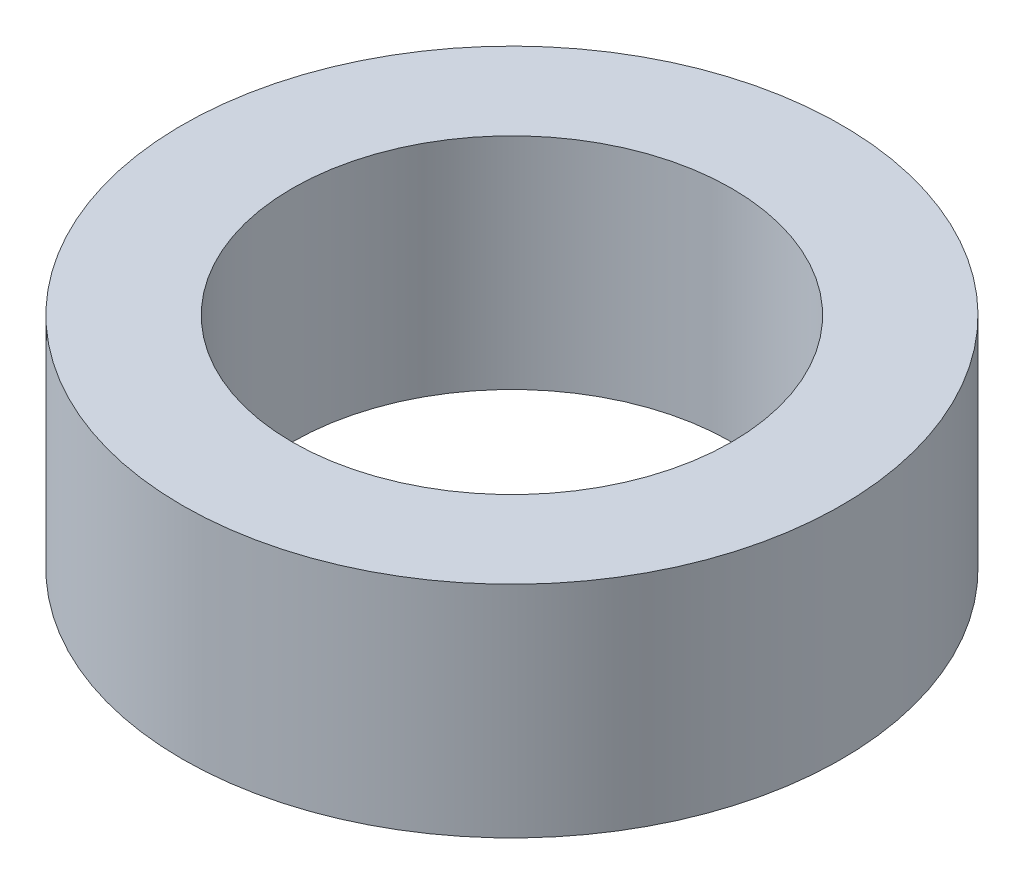
ISO-10303-21;
HEADER;
FILE_DESCRIPTION(('STEP AP214'),'2;1');
FILE_NAME('part.step','',(''),(''),'','','');
FILE_SCHEMA(('AUTOMOTIVE_DESIGN { 1 0 10303 214 1 1 1 1 }'));
ENDSEC;
DATA;
#1=APPLICATION_CONTEXT('core data for automotive mechanical design processes');
#2=APPLICATION_PROTOCOL_DEFINITION('international standard','automotive_design',2000,#1);
#3=PRODUCT_CONTEXT('',#1,'mechanical');
#4=PRODUCT('Part','Part','',(#3));
#5=PRODUCT_RELATED_PRODUCT_CATEGORY('part','',(#4));
#6=PRODUCT_DEFINITION_FORMATION('','',#4);
#7=PRODUCT_DEFINITION_CONTEXT('part definition',#1,'design');
#8=PRODUCT_DEFINITION('design','',#6,#7);
#9=PRODUCT_DEFINITION_SHAPE('','',#8);
#10=(LENGTH_UNIT() NAMED_UNIT(*) SI_UNIT(.MILLI.,.METRE.));
#11=(NAMED_UNIT(*) PLANE_ANGLE_UNIT() SI_UNIT($,.RADIAN.));
#12=(NAMED_UNIT(*) SI_UNIT($,.STERADIAN.) SOLID_ANGLE_UNIT());
#13=UNCERTAINTY_MEASURE_WITH_UNIT(LENGTH_MEASURE(1.E-05),#10,'distance_accuracy_value','');
#14=(GEOMETRIC_REPRESENTATION_CONTEXT(3) GLOBAL_UNCERTAINTY_ASSIGNED_CONTEXT((#13)) GLOBAL_UNIT_ASSIGNED_CONTEXT((#10,
#11,#12)) REPRESENTATION_CONTEXT('',''));
#15=CARTESIAN_POINT('',(0.,0.,0.));
#16=DIRECTION('',(0.,0.,1.));
#17=DIRECTION('',(1.,0.,0.));
#18=AXIS2_PLACEMENT_3D('',#15,#16,#17);
#19=CARTESIAN_POINT('',(0.,3.175,0.));
#20=DIRECTION('',(0.,1.,0.));
#21=DIRECTION('',(0.,0.,1.));
#22=AXIS2_PLACEMENT_3D('',#19,#20,#21);
#23=PLANE('',#22);
#24=CARTESIAN_POINT('',(0.,3.175,0.));
#25=DIRECTION('',(0.,1.,0.));
#26=DIRECTION('',(0.,0.,1.));
#27=AXIS2_PLACEMENT_3D('',#24,#25,#26);
#28=CIRCLE('',#27,4.7625);
#29=CARTESIAN_POINT('',(0.,3.175,4.7625));
#30=VERTEX_POINT('',#29);
#31=EDGE_CURVE('E10',#30,#30,#28,.T.);
#32=ORIENTED_EDGE('',*,*,#31,.T.);
#33=EDGE_LOOP('',(#32));
#34=FACE_BOUND('',#33,.T.);
#35=CARTESIAN_POINT('',(0.,3.175,0.));
#36=DIRECTION('',(0.,1.,0.));
#37=DIRECTION('',(0.,0.,1.));
#38=AXIS2_PLACEMENT_3D('',#35,#36,#37);
#39=CIRCLE('',#38,3.175);
#40=CARTESIAN_POINT('',(0.,3.175,3.175));
#41=VERTEX_POINT('',#40);
#42=EDGE_CURVE('E46',#41,#41,#39,.T.);
#43=ORIENTED_EDGE('',*,*,#42,.F.);
#44=EDGE_LOOP('',(#43));
#45=FACE_BOUND('',#44,.T.);
#46=ADVANCED_FACE('F35',(#34,#45),#23,.T.);
#47=CARTESIAN_POINT('',(0.,0.,0.));
#48=DIRECTION('',(0.,1.,0.));
#49=DIRECTION('',(0.,0.,1.));
#50=AXIS2_PLACEMENT_3D('',#47,#48,#49);
#51=PLANE('',#50);
#52=CARTESIAN_POINT('',(0.,0.,0.));
#53=DIRECTION('',(0.,1.,0.));
#54=DIRECTION('',(0.,0.,1.));
#55=AXIS2_PLACEMENT_3D('',#52,#53,#54);
#56=CIRCLE('',#55,4.7625);
#57=CARTESIAN_POINT('',(0.,0.,4.7625));
#58=VERTEX_POINT('',#57);
#59=EDGE_CURVE('E39',#58,#58,#56,.T.);
#60=ORIENTED_EDGE('',*,*,#59,.F.);
#61=EDGE_LOOP('',(#60));
#62=FACE_BOUND('',#61,.T.);
#63=CARTESIAN_POINT('',(0.,0.,0.));
#64=DIRECTION('',(0.,1.,0.));
#65=DIRECTION('',(0.,0.,1.));
#66=AXIS2_PLACEMENT_3D('',#63,#64,#65);
#67=CIRCLE('',#66,3.175);
#68=CARTESIAN_POINT('',(0.,0.,3.175));
#69=VERTEX_POINT('',#68);
#70=EDGE_CURVE('E48',#69,#69,#67,.T.);
#71=ORIENTED_EDGE('',*,*,#70,.T.);
#72=EDGE_LOOP('',(#71));
#73=FACE_BOUND('',#72,.T.);
#74=ADVANCED_FACE('F58',(#62,#73),#51,.F.);
#75=CARTESIAN_POINT('',(0.,3.175,0.));
#76=DIRECTION('',(0.,-1.,0.));
#77=DIRECTION('',(0.,0.,-1.));
#78=AXIS2_PLACEMENT_3D('',#75,#76,#77);
#79=CYLINDRICAL_SURFACE('',#78,4.7625);
#80=ORIENTED_EDGE('',*,*,#31,.F.);
#81=EDGE_LOOP('',(#80));
#82=FACE_BOUND('',#81,.T.);
#83=ORIENTED_EDGE('',*,*,#59,.T.);
#84=EDGE_LOOP('',(#83));
#85=FACE_BOUND('',#84,.T.);
#86=ADVANCED_FACE('F37',(#82,#85),#79,.T.);
#87=CARTESIAN_POINT('',(0.,3.175,0.));
#88=DIRECTION('',(0.,-1.,0.));
#89=DIRECTION('',(0.,0.,-1.));
#90=AXIS2_PLACEMENT_3D('',#87,#88,#89);
#91=CYLINDRICAL_SURFACE('',#90,3.175);
#92=ORIENTED_EDGE('',*,*,#42,.T.);
#93=EDGE_LOOP('',(#92));
#94=FACE_BOUND('',#93,.T.);
#95=ORIENTED_EDGE('',*,*,#70,.F.);
#96=EDGE_LOOP('',(#95));
#97=FACE_BOUND('',#96,.T.);
#98=ADVANCED_FACE('F54',(#94,#97),#91,.F.);
#99=CLOSED_SHELL('',(#46,#74,#86,#98));
#100=MANIFOLD_SOLID_BREP('B2',#99);
#101=ADVANCED_BREP_SHAPE_REPRESENTATION('',(#18,#100),#14);
#102=SHAPE_DEFINITION_REPRESENTATION(#9,#101);
ENDSEC;
END-ISO-10303-21;
